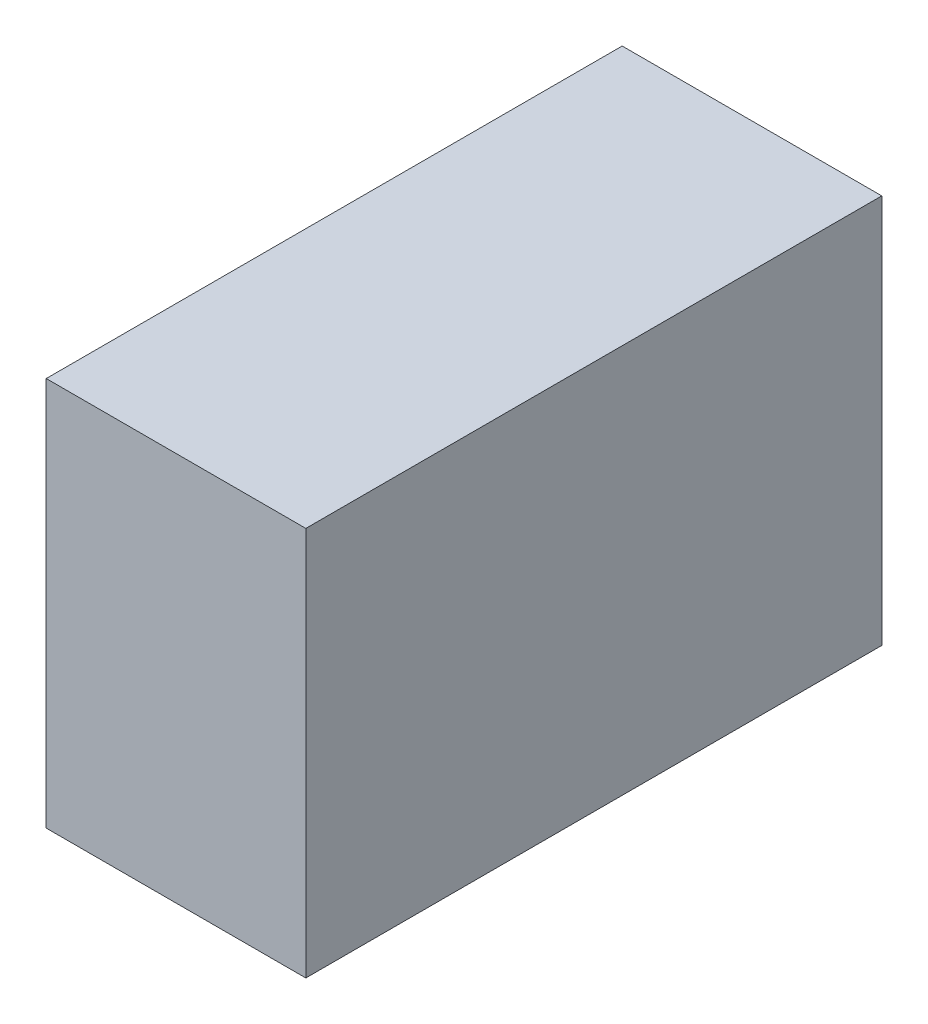
ISO-10303-21;
HEADER;
FILE_DESCRIPTION(('STEP AP214'),'2;1');
FILE_NAME('part.step','',(''),(''),'','','');
FILE_SCHEMA(('AUTOMOTIVE_DESIGN { 1 0 10303 214 1 1 1 1 }'));
ENDSEC;
DATA;
#1=APPLICATION_CONTEXT('core data for automotive mechanical design processes');
#2=APPLICATION_PROTOCOL_DEFINITION('international standard','automotive_design',2000,#1);
#3=PRODUCT_CONTEXT('',#1,'mechanical');
#4=PRODUCT('Part','Part','',(#3));
#5=PRODUCT_RELATED_PRODUCT_CATEGORY('part','',(#4));
#6=PRODUCT_DEFINITION_FORMATION('','',#4);
#7=PRODUCT_DEFINITION_CONTEXT('part definition',#1,'design');
#8=PRODUCT_DEFINITION('design','',#6,#7);
#9=PRODUCT_DEFINITION_SHAPE('','',#8);
#10=(LENGTH_UNIT() NAMED_UNIT(*) SI_UNIT(.MILLI.,.METRE.));
#11=(NAMED_UNIT(*) PLANE_ANGLE_UNIT() SI_UNIT($,.RADIAN.));
#12=(NAMED_UNIT(*) SI_UNIT($,.STERADIAN.) SOLID_ANGLE_UNIT());
#13=UNCERTAINTY_MEASURE_WITH_UNIT(LENGTH_MEASURE(1.E-05),#10,'distance_accuracy_value','');
#14=(GEOMETRIC_REPRESENTATION_CONTEXT(3) GLOBAL_UNCERTAINTY_ASSIGNED_CONTEXT((#13)) GLOBAL_UNIT_ASSIGNED_CONTEXT((#10,
#11,#12)) REPRESENTATION_CONTEXT('',''));
#15=CARTESIAN_POINT('',(0.,0.,0.));
#16=DIRECTION('',(0.,0.,1.));
#17=DIRECTION('',(1.,0.,0.));
#18=AXIS2_PLACEMENT_3D('',#15,#16,#17);
#19=CARTESIAN_POINT('',(0.,76.2,0.));
#20=DIRECTION('',(1.,0.,0.));
#21=DIRECTION('',(0.,0.,-1.));
#22=AXIS2_PLACEMENT_3D('',#19,#20,#21);
#23=PLANE('',#22);
#24=DIRECTION('',(0.,0.,1.));
#25=VECTOR('',#24,1.);
#26=CARTESIAN_POINT('',(0.,0.,0.));
#27=LINE('',#26,#25);
#28=CARTESIAN_POINT('',(0.,0.,-112.7125));
#29=VERTEX_POINT('',#28);
#30=CARTESIAN_POINT('',(0.,0.,0.));
#31=VERTEX_POINT('',#30);
#32=EDGE_CURVE('E111',#29,#31,#27,.T.);
#33=ORIENTED_EDGE('',*,*,#32,.T.);
#34=DIRECTION('',(0.,-1.,0.));
#35=VECTOR('',#34,1.);
#36=CARTESIAN_POINT('',(0.,76.2,0.));
#37=LINE('',#36,#35);
#38=CARTESIAN_POINT('',(0.,76.2,0.));
#39=VERTEX_POINT('',#38);
#40=EDGE_CURVE('E11',#39,#31,#37,.T.);
#41=ORIENTED_EDGE('',*,*,#40,.F.);
#42=DIRECTION('',(0.,0.,1.));
#43=VECTOR('',#42,1.);
#44=CARTESIAN_POINT('',(0.,76.2,0.));
#45=LINE('',#44,#43);
#46=CARTESIAN_POINT('',(0.,76.2,-112.7125));
#47=VERTEX_POINT('',#46);
#48=EDGE_CURVE('E100',#47,#39,#45,.T.);
#49=ORIENTED_EDGE('',*,*,#48,.F.);
#50=DIRECTION('',(0.,-1.,0.));
#51=VECTOR('',#50,1.);
#52=CARTESIAN_POINT('',(0.,76.2,-112.7125));
#53=LINE('',#52,#51);
#54=EDGE_CURVE('E108',#47,#29,#53,.T.);
#55=ORIENTED_EDGE('',*,*,#54,.T.);
#56=EDGE_LOOP('',(#33,#41,#49,#55));
#57=FACE_BOUND('',#56,.T.);
#58=ADVANCED_FACE('F44',(#57),#23,.F.);
#59=CARTESIAN_POINT('',(0.,76.2,0.));
#60=DIRECTION('',(0.,0.,-1.));
#61=DIRECTION('',(-1.,0.,0.));
#62=AXIS2_PLACEMENT_3D('',#59,#60,#61);
#63=PLANE('',#62);
#64=DIRECTION('',(1.,0.,0.));
#65=VECTOR('',#64,1.);
#66=CARTESIAN_POINT('',(0.,0.,0.));
#67=LINE('',#66,#65);
#68=CARTESIAN_POINT('',(50.8,0.,0.));
#69=VERTEX_POINT('',#68);
#70=EDGE_CURVE('E105',#31,#69,#67,.T.);
#71=ORIENTED_EDGE('',*,*,#70,.T.);
#72=DIRECTION('',(0.,-1.,0.));
#73=VECTOR('',#72,1.);
#74=CARTESIAN_POINT('',(50.8,76.2,0.));
#75=LINE('',#74,#73);
#76=CARTESIAN_POINT('',(50.8,76.2,0.));
#77=VERTEX_POINT('',#76);
#78=EDGE_CURVE('E53',#77,#69,#75,.T.);
#79=ORIENTED_EDGE('',*,*,#78,.F.);
#80=DIRECTION('',(1.,0.,0.));
#81=VECTOR('',#80,1.);
#82=CARTESIAN_POINT('',(0.,76.2,0.));
#83=LINE('',#82,#81);
#84=EDGE_CURVE('E95',#39,#77,#83,.T.);
#85=ORIENTED_EDGE('',*,*,#84,.F.);
#86=ORIENTED_EDGE('',*,*,#40,.T.);
#87=EDGE_LOOP('',(#71,#79,#85,#86));
#88=FACE_BOUND('',#87,.T.);
#89=ADVANCED_FACE('F102',(#88),#63,.F.);
#90=CARTESIAN_POINT('',(50.8,76.2,0.));
#91=DIRECTION('',(-1.,0.,0.));
#92=DIRECTION('',(0.,0.,1.));
#93=AXIS2_PLACEMENT_3D('',#90,#91,#92);
#94=PLANE('',#93);
#95=DIRECTION('',(0.,0.,-1.));
#96=VECTOR('',#95,1.);
#97=CARTESIAN_POINT('',(50.8,0.,0.));
#98=LINE('',#97,#96);
#99=CARTESIAN_POINT('',(50.8,0.,-112.7125));
#100=VERTEX_POINT('',#99);
#101=EDGE_CURVE('E80',#69,#100,#98,.T.);
#102=ORIENTED_EDGE('',*,*,#101,.T.);
#103=DIRECTION('',(0.,-1.,0.));
#104=VECTOR('',#103,1.);
#105=CARTESIAN_POINT('',(50.8,76.2,-112.7125));
#106=LINE('',#105,#104);
#107=CARTESIAN_POINT('',(50.8,76.2,-112.7125));
#108=VERTEX_POINT('',#107);
#109=EDGE_CURVE('E101',#108,#100,#106,.T.);
#110=ORIENTED_EDGE('',*,*,#109,.F.);
#111=DIRECTION('',(0.,0.,-1.));
#112=VECTOR('',#111,1.);
#113=CARTESIAN_POINT('',(50.8,76.2,0.));
#114=LINE('',#113,#112);
#115=EDGE_CURVE('E94',#77,#108,#114,.T.);
#116=ORIENTED_EDGE('',*,*,#115,.F.);
#117=ORIENTED_EDGE('',*,*,#78,.T.);
#118=EDGE_LOOP('',(#102,#110,#116,#117));
#119=FACE_BOUND('',#118,.T.);
#120=ADVANCED_FACE('F103',(#119),#94,.F.);
#121=CARTESIAN_POINT('',(0.,76.2,-112.7125));
#122=DIRECTION('',(0.,0.,1.));
#123=DIRECTION('',(1.,0.,0.));
#124=AXIS2_PLACEMENT_3D('',#121,#122,#123);
#125=PLANE('',#124);
#126=DIRECTION('',(-1.,0.,0.));
#127=VECTOR('',#126,1.);
#128=CARTESIAN_POINT('',(0.,0.,-112.7125));
#129=LINE('',#128,#127);
#130=EDGE_CURVE('E82',#100,#29,#129,.T.);
#131=ORIENTED_EDGE('',*,*,#130,.T.);
#132=ORIENTED_EDGE('',*,*,#54,.F.);
#133=DIRECTION('',(-1.,0.,0.));
#134=VECTOR('',#133,1.);
#135=CARTESIAN_POINT('',(0.,76.2,-112.7125));
#136=LINE('',#135,#134);
#137=EDGE_CURVE('E62',#108,#47,#136,.T.);
#138=ORIENTED_EDGE('',*,*,#137,.F.);
#139=ORIENTED_EDGE('',*,*,#109,.T.);
#140=EDGE_LOOP('',(#131,#132,#138,#139));
#141=FACE_BOUND('',#140,.T.);
#142=ADVANCED_FACE('F128',(#141),#125,.F.);
#143=CARTESIAN_POINT('',(0.,76.2,0.));
#144=DIRECTION('',(0.,-1.,0.));
#145=DIRECTION('',(0.,0.,-1.));
#146=AXIS2_PLACEMENT_3D('',#143,#144,#145);
#147=PLANE('',#146);
#148=ORIENTED_EDGE('',*,*,#48,.T.);
#149=ORIENTED_EDGE('',*,*,#84,.T.);
#150=ORIENTED_EDGE('',*,*,#115,.T.);
#151=ORIENTED_EDGE('',*,*,#137,.T.);
#152=EDGE_LOOP('',(#148,#149,#150,#151));
#153=FACE_BOUND('',#152,.T.);
#154=ADVANCED_FACE('F93',(#153),#147,.F.);
#155=CARTESIAN_POINT('',(0.,0.,0.));
#156=DIRECTION('',(0.,-1.,0.));
#157=DIRECTION('',(0.,0.,-1.));
#158=AXIS2_PLACEMENT_3D('',#155,#156,#157);
#159=PLANE('',#158);
#160=ORIENTED_EDGE('',*,*,#32,.F.);
#161=ORIENTED_EDGE('',*,*,#130,.F.);
#162=ORIENTED_EDGE('',*,*,#101,.F.);
#163=ORIENTED_EDGE('',*,*,#70,.F.);
#164=EDGE_LOOP('',(#160,#161,#162,#163));
#165=FACE_BOUND('',#164,.T.);
#166=ADVANCED_FACE('F129',(#165),#159,.T.);
#167=CLOSED_SHELL('',(#58,#89,#120,#142,#154,#166));
#168=MANIFOLD_SOLID_BREP('B2',#167);
#169=ADVANCED_BREP_SHAPE_REPRESENTATION('',(#18,#168),#14);
#170=SHAPE_DEFINITION_REPRESENTATION(#9,#169);
ENDSEC;
END-ISO-10303-21;
